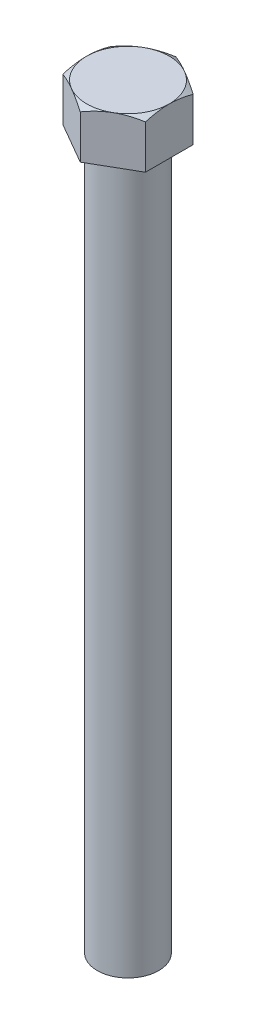
ISO-10303-21;
HEADER;
FILE_DESCRIPTION(('STEP AP214'),'2;1');
FILE_NAME('part.step','',(''),(''),'','','');
FILE_SCHEMA(('AUTOMOTIVE_DESIGN { 1 0 10303 214 1 1 1 1 }'));
ENDSEC;
DATA;
#1=APPLICATION_CONTEXT('core data for automotive mechanical design processes');
#2=APPLICATION_PROTOCOL_DEFINITION('international standard','automotive_design',2000,#1);
#3=PRODUCT_CONTEXT('',#1,'mechanical');
#4=PRODUCT('Part','Part','',(#3));
#5=PRODUCT_RELATED_PRODUCT_CATEGORY('part','',(#4));
#6=PRODUCT_DEFINITION_FORMATION('','',#4);
#7=PRODUCT_DEFINITION_CONTEXT('part definition',#1,'design');
#8=PRODUCT_DEFINITION('design','',#6,#7);
#9=PRODUCT_DEFINITION_SHAPE('','',#8);
#10=(LENGTH_UNIT() NAMED_UNIT(*) SI_UNIT(.MILLI.,.METRE.));
#11=(NAMED_UNIT(*) PLANE_ANGLE_UNIT() SI_UNIT($,.RADIAN.));
#12=(NAMED_UNIT(*) SI_UNIT($,.STERADIAN.) SOLID_ANGLE_UNIT());
#13=UNCERTAINTY_MEASURE_WITH_UNIT(LENGTH_MEASURE(1.E-05),#10,'distance_accuracy_value','');
#14=(GEOMETRIC_REPRESENTATION_CONTEXT(3) GLOBAL_UNCERTAINTY_ASSIGNED_CONTEXT((#13)) GLOBAL_UNIT_ASSIGNED_CONTEXT((#10,
#11,#12)) REPRESENTATION_CONTEXT('',''));
#15=CARTESIAN_POINT('',(0.,0.,0.));
#16=DIRECTION('',(0.,0.,1.));
#17=DIRECTION('',(1.,0.,0.));
#18=AXIS2_PLACEMENT_3D('',#15,#16,#17);
#19=CARTESIAN_POINT('',(4.44499999999997,2.54,-2.56632194654794));
#20=DIRECTION('',(-0.499999999999995,0.,0.866025403784442));
#21=DIRECTION('',(0.866025403784442,0.,0.499999999999995));
#22=AXIS2_PLACEMENT_3D('',#19,#20,#21);
#23=PLANE('',#22);
#24=CARTESIAN_POINT('',(4.44519999999997,2.14292194429822,-2.5662064764941));
#25=CARTESIAN_POINT('',(4.24986579470797,2.20805657093736,-2.67898273250138));
#26=CARTESIAN_POINT('',(4.05284547477849,2.2672939412632,-2.79273246724849));
#27=CARTESIAN_POINT('',(3.65539328473748,2.37069291144292,-3.02220159615867));
#28=CARTESIAN_POINT('',(3.45495435293051,2.41481793333261,-3.1379250673935));
#29=CARTESIAN_POINT('',(3.05656052986786,2.48350433724155,-3.36793784838221));
#30=CARTESIAN_POINT('',(2.85866693318103,2.50852287412248,-3.48219176970025));
#31=CARTESIAN_POINT('',(2.46194867413884,2.53838874032065,-3.71123716335069));
#32=CARTESIAN_POINT('',(2.26312545356158,2.54326080228227,-3.82602780327212));
#33=CARTESIAN_POINT('',(1.89161923394912,2.53312038077342,-4.04051701917099));
#34=CARTESIAN_POINT('',(1.71888059668701,2.52059771326113,-4.14024771789372));
#35=CARTESIAN_POINT('',(1.37452870288893,2.48090971292823,-4.339059376474));
#36=CARTESIAN_POINT('',(1.20291663722813,2.45373082512862,-4.43813964877945));
#37=CARTESIAN_POINT('',(0.857854865734964,2.38578630030974,-4.63736115543807));
#38=CARTESIAN_POINT('',(0.684448828706878,2.34473267413266,-4.73747717759534));
#39=CARTESIAN_POINT('',(0.340222933799418,2.25155731393392,-4.9362160906822));
#40=CARTESIAN_POINT('',(0.169398666530116,2.19945747021142,-5.03484152737425));
#41=CARTESIAN_POINT('',(-0.000200000000000184,2.14292194429822,-5.13275936314961));
#42=B_SPLINE_CURVE_WITH_KNOTS('',3,(#24,#25,#26,#27,#28,#29,#30,#31,#32,#33,#34,#35,#36,#37,#38,
#39,#40,#41),.UNSPECIFIED.,.F.,.F.,(4,2,2,2,2,2,2,2,4),(0.,0.704583898211653,1.41086131642101,
2.09965901433262,2.78761086425163,3.38660323540636,3.98615054427457,4.59899609230844,
5.21063832934908),.UNSPECIFIED.);
#43=CARTESIAN_POINT('',(4.44499999999997,2.14298861321456,-2.56632194654794));
#44=VERTEX_POINT('',#43);
#45=CARTESIAN_POINT('',(2.22249999999998,2.54,-3.84948291982184));
#46=VERTEX_POINT('',#45);
#47=EDGE_CURVE('E119',#44,#46,#42,.T.);
#48=ORIENTED_EDGE('',*,*,#47,.F.);
#49=DIRECTION('',(0.,-1.,0.));
#50=VECTOR('',#49,1.);
#51=CARTESIAN_POINT('',(4.44499999999997,2.54,-2.56632194654794));
#52=LINE('',#51,#50);
#53=CARTESIAN_POINT('',(4.44499999999997,-2.54,-2.56632194654794));
#54=VERTEX_POINT('',#53);
#55=EDGE_CURVE('E310',#44,#54,#52,.T.);
#56=ORIENTED_EDGE('',*,*,#55,.T.);
#57=DIRECTION('',(-0.866025403784441,0.,-0.499999999999995));
#58=VECTOR('',#57,1.);
#59=CARTESIAN_POINT('',(4.44499999999997,-2.54,-2.56632194654794));
#60=LINE('',#59,#58);
#61=CARTESIAN_POINT('',(0.,-2.54,-5.13264389309577));
#62=VERTEX_POINT('',#61);
#63=EDGE_CURVE('E128',#54,#62,#60,.T.);
#64=ORIENTED_EDGE('',*,*,#63,.T.);
#65=DIRECTION('',(0.,-1.,0.));
#66=VECTOR('',#65,1.);
#67=CARTESIAN_POINT('',(0.,2.54,-5.13264389309577));
#68=LINE('',#67,#66);
#69=CARTESIAN_POINT('',(0.,2.14298861321456,-5.13264389309577));
#70=VERTEX_POINT('',#69);
#71=EDGE_CURVE('E146',#70,#62,#68,.T.);
#72=ORIENTED_EDGE('',*,*,#71,.F.);
#73=EDGE_CURVE('E129',#46,#70,#42,.T.);
#74=ORIENTED_EDGE('',*,*,#73,.F.);
#75=EDGE_LOOP('',(#48,#56,#64,#72,#74));
#76=FACE_BOUND('',#75,.T.);
#77=ADVANCED_FACE('F46',(#76),#23,.F.);
#78=CARTESIAN_POINT('',(0.,2.54,-5.13264389309577));
#79=DIRECTION('',(0.500000000000001,0.,0.866025403784438));
#80=DIRECTION('',(0.866025403784438,0.,-0.500000000000001));
#81=AXIS2_PLACEMENT_3D('',#78,#79,#80);
#82=PLANE('',#81);
#83=CARTESIAN_POINT('',(0.000200000000000009,2.14292194429822,-5.13275936314961));
#84=CARTESIAN_POINT('',(-0.195134205292001,2.20805657093736,-5.01998310714233));
#85=CARTESIAN_POINT('',(-0.392154525221478,2.2672939412632,-4.90623337239522));
#86=CARTESIAN_POINT('',(-0.789606715262486,2.37069291144293,-4.67676424348504));
#87=CARTESIAN_POINT('',(-0.990045647069459,2.41481793333262,-4.5610407722502));
#88=CARTESIAN_POINT('',(-1.38843947013211,2.48350433724155,-4.3310279912615));
#89=CARTESIAN_POINT('',(-1.58633306681894,2.50852287412248,-4.21677406994346));
#90=CARTESIAN_POINT('',(-1.98305132586113,2.53838874032066,-3.98772867629301));
#91=CARTESIAN_POINT('',(-2.18187454643838,2.54326080228228,-3.87293803637158));
#92=CARTESIAN_POINT('',(-2.55338076605084,2.53312038077344,-3.6584488204727));
#93=CARTESIAN_POINT('',(-2.72611940331296,2.52059771326114,-3.55871812174997));
#94=CARTESIAN_POINT('',(-3.07047129711105,2.48090971292824,-3.35990646316969));
#95=CARTESIAN_POINT('',(-3.24208336277185,2.45373082512863,-3.26082619086423));
#96=CARTESIAN_POINT('',(-3.58714513426502,2.38578630030975,-3.0616046842056));
#97=CARTESIAN_POINT('',(-3.76055117129311,2.34473267413267,-2.96148866204833));
#98=CARTESIAN_POINT('',(-4.10477706620058,2.25155731393393,-2.76274974896146));
#99=CARTESIAN_POINT('',(-4.27560133346989,2.19945747021143,-2.66412431226941));
#100=CARTESIAN_POINT('',(-4.44520000000001,2.14292194429822,-2.56620647649404));
#101=B_SPLINE_CURVE_WITH_KNOTS('',3,(#83,#84,#85,#86,#87,#88,#89,#90,#91,#92,#93,#94,#95,#96,
#97,#98,#99,#100),.UNSPECIFIED.,.F.,.F.,(4,2,2,2,2,2,2,2,4),(0.,0.704583898211653,
1.41086131642101,2.09965901433262,2.78761086425163,3.38660323540637,3.9861505442746,
4.59899609230849,5.21063832934914),.UNSPECIFIED.);
#102=CARTESIAN_POINT('',(-2.22250000000001,2.54,-3.84948291982183));
#103=VERTEX_POINT('',#102);
#104=EDGE_CURVE('E136',#70,#103,#101,.T.);
#105=ORIENTED_EDGE('',*,*,#104,.F.);
#106=ORIENTED_EDGE('',*,*,#71,.T.);
#107=DIRECTION('',(-0.866025403784438,0.,0.500000000000001));
#108=VECTOR('',#107,1.);
#109=CARTESIAN_POINT('',(0.,-2.54,-5.13264389309577));
#110=LINE('',#109,#108);
#111=CARTESIAN_POINT('',(-4.44500000000001,-2.54,-2.56632194654788));
#112=VERTEX_POINT('',#111);
#113=EDGE_CURVE('E296',#62,#112,#110,.T.);
#114=ORIENTED_EDGE('',*,*,#113,.T.);
#115=DIRECTION('',(0.,-1.,0.));
#116=VECTOR('',#115,1.);
#117=CARTESIAN_POINT('',(-4.44500000000001,2.54,-2.56632194654788));
#118=LINE('',#117,#116);
#119=CARTESIAN_POINT('',(-4.44500000000001,2.14298861321456,-2.56632194654788));
#120=VERTEX_POINT('',#119);
#121=EDGE_CURVE('E222',#120,#112,#118,.T.);
#122=ORIENTED_EDGE('',*,*,#121,.F.);
#123=EDGE_CURVE('E149',#103,#120,#101,.T.);
#124=ORIENTED_EDGE('',*,*,#123,.F.);
#125=EDGE_LOOP('',(#105,#106,#114,#122,#124));
#126=FACE_BOUND('',#125,.T.);
#127=ADVANCED_FACE('F210',(#126),#82,.F.);
#128=CARTESIAN_POINT('',(-4.44500000000001,2.54,-2.56632194654788));
#129=DIRECTION('',(1.,0.,0.));
#130=DIRECTION('',(0.,0.,-1.));
#131=AXIS2_PLACEMENT_3D('',#128,#129,#130);
#132=PLANE('',#131);
#133=CARTESIAN_POINT('',(-4.44500000000003,-0.913793553764363,-9.43225036305228));
#134=CARTESIAN_POINT('',(-4.44500000000003,-0.799939464876854,-9.21422222232646));
#135=CARTESIAN_POINT('',(-4.44500000000003,-0.68662714073554,-8.99590893694939));
#136=CARTESIAN_POINT('',(-4.44500000000003,-0.461361050932909,-8.55857151988882));
#137=CARTESIAN_POINT('',(-4.44500000000003,-0.349407341607159,-8.33954735920261));
#138=CARTESIAN_POINT('',(-4.44500000000003,-0.126979863125515,-7.90034356959816));
#139=CARTESIAN_POINT('',(-4.44500000000003,-0.0165085071575113,-7.68016271663262));
#140=CARTESIAN_POINT('',(-4.44500000000002,0.202398705212408,-7.23879398225191));
#141=CARTESIAN_POINT('',(-4.44500000000002,0.310834590773045,-7.01760611531901));
#142=CARTESIAN_POINT('',(-4.44500000000002,0.531229787322069,-6.56146713388191));
#143=CARTESIAN_POINT('',(-4.44500000000002,0.643041856033314,-6.3264446904743));
#144=CARTESIAN_POINT('',(-4.44500000000002,0.863040494433213,-5.85471049641595));
#145=CARTESIAN_POINT('',(-4.44500000000002,0.97122714911754,-5.61799878552712));
#146=CARTESIAN_POINT('',(-4.44500000000002,1.18283489632335,-5.14258317678223));
#147=CARTESIAN_POINT('',(-4.44500000000002,1.28625830016107,-4.90388031296643));
#148=CARTESIAN_POINT('',(-4.44500000000001,1.48686883477102,-4.42388087539124));
#149=CARTESIAN_POINT('',(-4.44500000000001,1.58405654672986,-4.18258454580583));
#150=CARTESIAN_POINT('',(-4.44500000000001,1.78084193214057,-3.66873426469664));
#151=CARTESIAN_POINT('',(-4.44500000000001,1.87942394276431,-3.39578596515782));
#152=CARTESIAN_POINT('',(-4.44500000000001,2.0621435600319,-2.84497498911748));
#153=CARTESIAN_POINT('',(-4.44500000000001,2.1462788796667,-2.56711154218041));
#154=CARTESIAN_POINT('',(-4.44500000000001,2.29293585486918,-2.01168629382167));
#155=CARTESIAN_POINT('',(-4.44500000000001,2.35586873274095,-1.73423723011389));
#156=CARTESIAN_POINT('',(-4.445,2.43120349492403,-1.31469921034624));
#157=CARTESIAN_POINT('',(-4.445,2.45313637580591,-1.17430713518009));
#158=CARTESIAN_POINT('',(-4.445,2.48996434819672,-0.892612224475832));
#159=CARTESIAN_POINT('',(-4.445,2.50486063425895,-0.751309547655664));
#160=CARTESIAN_POINT('',(-4.445,2.52727959876194,-0.465555537822996));
#161=CARTESIAN_POINT('',(-4.445,2.53466480236686,-0.321093292334079));
#162=CARTESIAN_POINT('',(-4.445,2.54128879275954,-0.0319812773757936));
#163=CARTESIAN_POINT('',(-4.445,2.54052763417278,0.112668490829636));
#164=CARTESIAN_POINT('',(-4.445,2.53088783566023,0.401713765202374));
#165=CARTESIAN_POINT('',(-4.445,2.52200822574438,0.546109238921088));
#166=CARTESIAN_POINT('',(-4.445,2.49649313483878,0.83419867818099));
#167=CARTESIAN_POINT('',(-4.445,2.47985743787404,0.977892624074928));
#168=CARTESIAN_POINT('',(-4.44499999999999,2.41832310581975,1.41360737399664));
#169=CARTESIAN_POINT('',(-4.44499999999999,2.36204122384692,1.70406586069358));
#170=CARTESIAN_POINT('',(-4.44499999999999,2.2602209118653,2.13546189272905));
#171=CARTESIAN_POINT('',(-4.44499999999999,2.22336551212094,2.27859390746492));
#172=CARTESIAN_POINT('',(-4.44499999999999,2.14468169228814,2.56349565803156));
#173=CARTESIAN_POINT('',(-4.44499999999999,2.1028532671832,2.70526539248799));
#174=CARTESIAN_POINT('',(-4.44499999999999,1.96636328615321,3.14371334498782));
#175=CARTESIAN_POINT('',(-4.44499999999999,1.86447604841242,3.43813571248947));
#176=CARTESIAN_POINT('',(-4.44499999999999,1.64771207452743,4.02217410357603));
#177=CARTESIAN_POINT('',(-4.44499999999998,1.53283050448568,4.31178829226819));
#178=CARTESIAN_POINT('',(-4.44499999999998,1.29375704778267,4.88763477422153));
#179=CARTESIAN_POINT('',(-4.44499999999998,1.16955132017274,5.17386127941996));
#180=CARTESIAN_POINT('',(-4.44499999999998,0.914606930430403,5.74331493687461));
#181=CARTESIAN_POINT('',(-4.44499999999998,0.783869290414999,6.02654255004504));
#182=CARTESIAN_POINT('',(-4.44499999999998,0.526196668351574,6.57249307029261));
#183=CARTESIAN_POINT('',(-4.44499999999998,0.399561917038162,6.83535826659632));
#184=CARTESIAN_POINT('',(-4.44499999999997,0.14307880432994,7.35952757385614));
#185=CARTESIAN_POINT('',(-4.44499999999997,0.0132302933758086,7.62083161145517));
#186=CARTESIAN_POINT('',(-4.44499999999997,-0.248386588974362,8.14106821825079));
#187=CARTESIAN_POINT('',(-4.44499999999997,-0.380144316428686,8.40000615273979));
#188=CARTESIAN_POINT('',(-4.44499999999997,-0.645618837036988,8.91684341347261));
#189=CARTESIAN_POINT('',(-4.44499999999997,-0.779335430293971,9.17474284231579));
#190=CARTESIAN_POINT('',(-4.44499999999997,-0.913793553764365,9.43225036305231));
#191=B_SPLINE_CURVE_WITH_KNOTS('',3,(#133,#134,#135,#136,#137,#138,#139,#140,#141,#142,#143,
#144,#145,#146,#147,#148,#149,#150,#151,#152,#153,#154,#155,#156,#157,#158,#159,#160,#161,#162,
#163,#164,#165,#166,#167,#168,#169,#170,#171,#172,#173,#174,#175,#176,#177,#178,#179,#180,#181,
#182,#183,#184,#185,#186,#187,#188,#189,#190),.UNSPECIFIED.,.F.,.F.,(4,2,2,2,2,2,2,2,2,2,2,2,2,
2,2,2,2,2,2,2,2,2,2,2,2,2,2,2,4),(0.,0.737898670351122,1.47582783416407,2.21484002208093,
2.95384161533626,3.73461045483919,4.51536097685688,5.29572856811453,6.07602332062079,
6.94634491301855,7.81680415644895,8.66925110589245,9.09538659456246,9.52144971518079,
9.95517785135082,10.3889030791563,10.8226801350915,11.2564692706476,12.1425569444736,
12.5859066800292,13.0292568628128,13.9634179036872,14.8979276029344,15.8338530320361,
16.7696324629604,17.6449395741668,18.5202874965781,19.3918749857373,20.263374142887),.UNSPECIFIED.);
#192=CARTESIAN_POINT('',(-4.445,2.54,0.));
#193=VERTEX_POINT('',#192);
#194=EDGE_CURVE('E204',#120,#193,#191,.T.);
#195=ORIENTED_EDGE('',*,*,#194,.F.);
#196=ORIENTED_EDGE('',*,*,#121,.T.);
#197=DIRECTION('',(0.,0.,1.));
#198=VECTOR('',#197,1.);
#199=CARTESIAN_POINT('',(-4.44500000000001,-2.54,-2.56632194654788));
#200=LINE('',#199,#198);
#201=CARTESIAN_POINT('',(-4.44499999999999,-2.54,2.56632194654791));
#202=VERTEX_POINT('',#201);
#203=EDGE_CURVE('E243',#112,#202,#200,.T.);
#204=ORIENTED_EDGE('',*,*,#203,.T.);
#205=DIRECTION('',(0.,-1.,0.));
#206=VECTOR('',#205,1.);
#207=CARTESIAN_POINT('',(-4.44499999999999,2.54,2.56632194654791));
#208=LINE('',#207,#206);
#209=CARTESIAN_POINT('',(-4.44499999999999,2.14298861321456,2.56632194654791));
#210=VERTEX_POINT('',#209);
#211=EDGE_CURVE('E241',#210,#202,#208,.T.);
#212=ORIENTED_EDGE('',*,*,#211,.F.);
#213=EDGE_CURVE('E197',#193,#210,#191,.T.);
#214=ORIENTED_EDGE('',*,*,#213,.F.);
#215=EDGE_LOOP('',(#195,#196,#204,#212,#214));
#216=FACE_BOUND('',#215,.T.);
#217=ADVANCED_FACE('F206',(#216),#132,.F.);
#218=CARTESIAN_POINT('',(-4.44499999999999,2.54,2.56632194654791));
#219=DIRECTION('',(0.499999999999995,0.,-0.866025403784441));
#220=DIRECTION('',(-0.866025403784442,0.,-0.499999999999995));
#221=AXIS2_PLACEMENT_3D('',#218,#219,#220);
#222=PLANE('',#221);
#223=CARTESIAN_POINT('',(-4.44519999999999,2.14292194429822,2.56620647649407));
#224=CARTESIAN_POINT('',(-4.24986579470799,2.20805657093736,2.67898273250135));
#225=CARTESIAN_POINT('',(-4.05284547477851,2.2672939412632,2.79273246724846));
#226=CARTESIAN_POINT('',(-3.6553932847375,2.37069291144293,3.02220159615864));
#227=CARTESIAN_POINT('',(-3.45495435293053,2.41481793333262,3.13792506739347));
#228=CARTESIAN_POINT('',(-3.05656052986788,2.48350433724155,3.36793784838217));
#229=CARTESIAN_POINT('',(-2.85866693318105,2.50852287412248,3.48219176970022));
#230=CARTESIAN_POINT('',(-2.46194867413886,2.53838874032066,3.71123716335066));
#231=CARTESIAN_POINT('',(-2.2631254535616,2.54326080228228,3.82602780327209));
#232=CARTESIAN_POINT('',(-1.89161923394914,2.53312038077344,4.04051701917096));
#233=CARTESIAN_POINT('',(-1.71888059668702,2.52059771326115,4.14024771789369));
#234=CARTESIAN_POINT('',(-1.37452870288893,2.48090971292824,4.33905937647398));
#235=CARTESIAN_POINT('',(-1.20291663722812,2.45373082512863,4.43813964877943));
#236=CARTESIAN_POINT('',(-0.857854865734951,2.38578630030975,4.63736115543806));
#237=CARTESIAN_POINT('',(-0.684448828706861,2.34473267413267,4.73747717759533));
#238=CARTESIAN_POINT('',(-0.340222933799393,2.25155731393393,4.93621609068219));
#239=CARTESIAN_POINT('',(-0.169398666530086,2.19945747021143,5.03484152737425));
#240=CARTESIAN_POINT('',(0.000200000000035309,2.14292194429822,5.13275936314961));
#241=B_SPLINE_CURVE_WITH_KNOTS('',3,(#223,#224,#225,#226,#227,#228,#229,#230,#231,#232,#233,
#234,#235,#236,#237,#238,#239,#240),.UNSPECIFIED.,.F.,.F.,(4,2,2,2,2,2,2,2,4),(0.,
0.704583898211653,1.41086131642101,2.09965901433262,2.78761086425163,3.38660323540637,
3.9861505442746,4.59899609230849,5.21063832934914),.UNSPECIFIED.);
#242=CARTESIAN_POINT('',(-2.22249999999998,2.54,3.84948291982184));
#243=VERTEX_POINT('',#242);
#244=EDGE_CURVE('E205',#210,#243,#241,.T.);
#245=ORIENTED_EDGE('',*,*,#244,.F.);
#246=ORIENTED_EDGE('',*,*,#211,.T.);
#247=DIRECTION('',(0.866025403784442,0.,0.499999999999995));
#248=VECTOR('',#247,1.);
#249=CARTESIAN_POINT('',(-4.44499999999999,-2.54,2.56632194654791));
#250=LINE('',#249,#248);
#251=CARTESIAN_POINT('',(0.,-2.54,5.13264389309577));
#252=VERTEX_POINT('',#251);
#253=EDGE_CURVE('E300',#202,#252,#250,.T.);
#254=ORIENTED_EDGE('',*,*,#253,.T.);
#255=DIRECTION('',(0.,-1.,0.));
#256=VECTOR('',#255,1.);
#257=CARTESIAN_POINT('',(0.,2.54,5.13264389309577));
#258=LINE('',#257,#256);
#259=CARTESIAN_POINT('',(0.,2.14298861321456,5.13264389309577));
#260=VERTEX_POINT('',#259);
#261=EDGE_CURVE('E248',#260,#252,#258,.T.);
#262=ORIENTED_EDGE('',*,*,#261,.F.);
#263=EDGE_CURVE('E191',#243,#260,#241,.T.);
#264=ORIENTED_EDGE('',*,*,#263,.F.);
#265=EDGE_LOOP('',(#245,#246,#254,#262,#264));
#266=FACE_BOUND('',#265,.T.);
#267=ADVANCED_FACE('F209',(#266),#222,.F.);
#268=CARTESIAN_POINT('',(0.,2.54,5.13264389309577));
#269=DIRECTION('',(-0.500000000000007,0.,-0.866025403784435));
#270=DIRECTION('',(-0.866025403784435,0.,0.500000000000007));
#271=AXIS2_PLACEMENT_3D('',#268,#269,#270);
#272=PLANE('',#271);
#273=CARTESIAN_POINT('',(-0.000199999999964167,2.14292194429822,5.13275936314961));
#274=CARTESIAN_POINT('',(0.195134205292037,2.20805657093736,5.01998310714233));
#275=CARTESIAN_POINT('',(0.392154525221512,2.2672939412632,4.90623337239522));
#276=CARTESIAN_POINT('',(0.789606715262519,2.37069291144292,4.67676424348504));
#277=CARTESIAN_POINT('',(0.990045647069491,2.41481793333262,4.5610407722502));
#278=CARTESIAN_POINT('',(1.38843947013214,2.48350433724155,4.33102799126149));
#279=CARTESIAN_POINT('',(1.58633306681897,2.50852287412248,4.21677406994345));
#280=CARTESIAN_POINT('',(1.98305132586115,2.53838874032066,3.98772867629299));
#281=CARTESIAN_POINT('',(2.18187454643841,2.54326080228228,3.87293803637157));
#282=CARTESIAN_POINT('',(2.55338076605087,2.53312038077344,3.65844882047269));
#283=CARTESIAN_POINT('',(2.72611940331298,2.52059771326114,3.55871812174996));
#284=CARTESIAN_POINT('',(3.07047129711107,2.48090971292824,3.35990646316967));
#285=CARTESIAN_POINT('',(3.24208336277188,2.45373082512863,3.26082619086421));
#286=CARTESIAN_POINT('',(3.58714513426505,2.38578630030975,3.06160468420558));
#287=CARTESIAN_POINT('',(3.76055117129313,2.34473267413267,2.9614886620483));
#288=CARTESIAN_POINT('',(4.1047770662006,2.25155731393393,2.76274974896143));
#289=CARTESIAN_POINT('',(4.2756013334699,2.19945747021143,2.66412431226938));
#290=CARTESIAN_POINT('',(4.44520000000002,2.14292194429822,2.56620647649401));
#291=B_SPLINE_CURVE_WITH_KNOTS('',3,(#273,#274,#275,#276,#277,#278,#279,#280,#281,#282,#283,
#284,#285,#286,#287,#288,#289,#290),.UNSPECIFIED.,.F.,.F.,(4,2,2,2,2,2,2,2,4),(0.,
0.704583898211652,1.41086131642101,2.09965901433262,2.78761086425163,3.38660323540637,
3.9861505442746,4.59899609230849,5.21063832934914),.UNSPECIFIED.);
#292=CARTESIAN_POINT('',(2.22250000000003,2.54,3.84948291982181));
#293=VERTEX_POINT('',#292);
#294=EDGE_CURVE('E264',#260,#293,#291,.T.);
#295=ORIENTED_EDGE('',*,*,#294,.F.);
#296=ORIENTED_EDGE('',*,*,#261,.T.);
#297=DIRECTION('',(0.866025403784435,0.,-0.500000000000007));
#298=VECTOR('',#297,1.);
#299=CARTESIAN_POINT('',(0.,-2.54,5.13264389309577));
#300=LINE('',#299,#298);
#301=CARTESIAN_POINT('',(4.44500000000003,-2.54,2.56632194654785));
#302=VERTEX_POINT('',#301);
#303=EDGE_CURVE('E305',#252,#302,#300,.T.);
#304=ORIENTED_EDGE('',*,*,#303,.T.);
#305=DIRECTION('',(0.,-1.,0.));
#306=VECTOR('',#305,1.);
#307=CARTESIAN_POINT('',(4.44500000000003,2.54,2.56632194654785));
#308=LINE('',#307,#306);
#309=CARTESIAN_POINT('',(4.44500000000003,2.14298861321456,2.56632194654785));
#310=VERTEX_POINT('',#309);
#311=EDGE_CURVE('E253',#310,#302,#308,.T.);
#312=ORIENTED_EDGE('',*,*,#311,.F.);
#313=EDGE_CURVE('E184',#293,#310,#291,.T.);
#314=ORIENTED_EDGE('',*,*,#313,.F.);
#315=EDGE_LOOP('',(#295,#296,#304,#312,#314));
#316=FACE_BOUND('',#315,.T.);
#317=ADVANCED_FACE('F263',(#316),#272,.F.);
#318=CARTESIAN_POINT('',(4.44500000000003,2.54,2.56632194654785));
#319=DIRECTION('',(-1.,0.,0.));
#320=DIRECTION('',(0.,0.,1.));
#321=AXIS2_PLACEMENT_3D('',#318,#319,#320);
#322=PLANE('',#321);
#323=CARTESIAN_POINT('',(4.4450000000001,-0.913793553764364,9.43225036305225));
#324=CARTESIAN_POINT('',(4.44500000000009,-0.799939464876855,9.21422222232643));
#325=CARTESIAN_POINT('',(4.44500000000009,-0.68662714073554,8.99590893694936));
#326=CARTESIAN_POINT('',(4.44500000000009,-0.46136105093291,8.55857151988879));
#327=CARTESIAN_POINT('',(4.44500000000009,-0.349407341607161,8.33954735920258));
#328=CARTESIAN_POINT('',(4.44500000000008,-0.126979863125517,7.90034356959814));
#329=CARTESIAN_POINT('',(4.44500000000008,-0.0165085071575137,7.68016271663259));
#330=CARTESIAN_POINT('',(4.44500000000007,0.202398705212406,7.23879398225188));
#331=CARTESIAN_POINT('',(4.44500000000007,0.310834590773043,7.01760611531898));
#332=CARTESIAN_POINT('',(4.44500000000007,0.531229787322067,6.56146713388189));
#333=CARTESIAN_POINT('',(4.44500000000007,0.643041856033312,6.32644469047428));
#334=CARTESIAN_POINT('',(4.44500000000006,0.863040494433211,5.85471049641593));
#335=CARTESIAN_POINT('',(4.44500000000006,0.971227149117539,5.61799878552709));
#336=CARTESIAN_POINT('',(4.44500000000005,1.18283489632335,5.1425831767822));
#337=CARTESIAN_POINT('',(4.44500000000005,1.28625830016107,4.9038803129664));
#338=CARTESIAN_POINT('',(4.44500000000004,1.48686883477102,4.42388087539121));
#339=CARTESIAN_POINT('',(4.44500000000004,1.58405654672986,4.18258454580581));
#340=CARTESIAN_POINT('',(4.44500000000004,1.78084193214056,3.66873426469662));
#341=CARTESIAN_POINT('',(4.44500000000003,1.87942394276431,3.39578596515779));
#342=CARTESIAN_POINT('',(4.44500000000003,2.0621435600319,2.84497498911745));
#343=CARTESIAN_POINT('',(4.44500000000003,2.1462788796667,2.56711154218038));
#344=CARTESIAN_POINT('',(4.44500000000002,2.29293585486918,2.01168629382164));
#345=CARTESIAN_POINT('',(4.44500000000002,2.35586873274095,1.73423723011386));
#346=CARTESIAN_POINT('',(4.44500000000001,2.43120349492403,1.31469921034621));
#347=CARTESIAN_POINT('',(4.44500000000001,2.45313637580591,1.17430713518007));
#348=CARTESIAN_POINT('',(4.44500000000001,2.48996434819672,0.892612224475803));
#349=CARTESIAN_POINT('',(4.44500000000001,2.50486063425895,0.751309547655635));
#350=CARTESIAN_POINT('',(4.445,2.52727959876194,0.465555537822968));
#351=CARTESIAN_POINT('',(4.445,2.53466480236686,0.321093292334051));
#352=CARTESIAN_POINT('',(4.445,2.54128879275954,0.0319812773757654));
#353=CARTESIAN_POINT('',(4.445,2.54052763417279,-0.112668490829665));
#354=CARTESIAN_POINT('',(4.44499999999999,2.53088783566023,-0.401713765202402));
#355=CARTESIAN_POINT('',(4.44499999999999,2.52200822574438,-0.546109238921116));
#356=CARTESIAN_POINT('',(4.44499999999999,2.49649313483878,-0.834198678181018));
#357=CARTESIAN_POINT('',(4.44499999999999,2.47985743787404,-0.977892624074957));
#358=CARTESIAN_POINT('',(4.44499999999998,2.41832310581976,-1.41360737399667));
#359=CARTESIAN_POINT('',(4.44499999999998,2.36204122384692,-1.70406586069361));
#360=CARTESIAN_POINT('',(4.44499999999998,2.2602209118653,-2.13546189272908));
#361=CARTESIAN_POINT('',(4.44499999999998,2.22336551212094,-2.27859390746495));
#362=CARTESIAN_POINT('',(4.44499999999997,2.14468169228814,-2.56349565803159));
#363=CARTESIAN_POINT('',(4.44499999999997,2.10285326718321,-2.70526539248802));
#364=CARTESIAN_POINT('',(4.44499999999997,1.96636328615321,-3.14371334498785));
#365=CARTESIAN_POINT('',(4.44499999999996,1.86447604841243,-3.43813571248949));
#366=CARTESIAN_POINT('',(4.44499999999996,1.64771207452744,-4.02217410357606));
#367=CARTESIAN_POINT('',(4.44499999999995,1.53283050448568,-4.31178829226822));
#368=CARTESIAN_POINT('',(4.44499999999995,1.29375704778267,-4.88763477422156));
#369=CARTESIAN_POINT('',(4.44499999999994,1.16955132017274,-5.17386127941999));
#370=CARTESIAN_POINT('',(4.44499999999994,0.914606930430405,-5.74331493687464));
#371=CARTESIAN_POINT('',(4.44499999999994,0.783869290415,-6.02654255004507));
#372=CARTESIAN_POINT('',(4.44499999999993,0.526196668351575,-6.57249307029263));
#373=CARTESIAN_POINT('',(4.44499999999993,0.399561917038164,-6.83535826659635));
#374=CARTESIAN_POINT('',(4.44499999999992,0.143078804329941,-7.35952757385617));
#375=CARTESIAN_POINT('',(4.44499999999992,0.0132302933758094,-7.6208316114552));
#376=CARTESIAN_POINT('',(4.44499999999991,-0.248386588974361,-8.14106821825082));
#377=CARTESIAN_POINT('',(4.44499999999991,-0.380144316428685,-8.40000615273982));
#378=CARTESIAN_POINT('',(4.4449999999999,-0.645618837036987,-8.91684341347264));
#379=CARTESIAN_POINT('',(4.4449999999999,-0.77933543029397,-9.17474284231583));
#380=CARTESIAN_POINT('',(4.4449999999999,-0.913793553764365,-9.43225036305235));
#381=B_SPLINE_CURVE_WITH_KNOTS('',3,(#323,#324,#325,#326,#327,#328,#329,#330,#331,#332,#333,
#334,#335,#336,#337,#338,#339,#340,#341,#342,#343,#344,#345,#346,#347,#348,#349,#350,#351,#352,
#353,#354,#355,#356,#357,#358,#359,#360,#361,#362,#363,#364,#365,#366,#367,#368,#369,#370,#371,
#372,#373,#374,#375,#376,#377,#378,#379,#380),.UNSPECIFIED.,.F.,.F.,(4,2,2,2,2,2,2,2,2,2,2,2,2,
2,2,2,2,2,2,2,2,2,2,2,2,2,2,2,4),(0.,0.737898670351122,1.47582783416407,2.21484002208093,
2.95384161533625,3.73461045483918,4.51536097685688,5.29572856811453,6.07602332062079,
6.94634491301854,7.81680415644895,8.66925110589245,9.09538659456246,9.52144971518079,
9.95517785135082,10.3889030791563,10.8226801350915,11.2564692706476,12.1425569444736,
12.5859066800292,13.0292568628128,13.9634179036872,14.8979276029344,15.8338530320361,
16.7696324629604,17.6449395741668,18.5202874965781,19.3918749857373,20.263374142887),.UNSPECIFIED.);
#382=CARTESIAN_POINT('',(4.445,2.54,0.));
#383=VERTEX_POINT('',#382);
#384=EDGE_CURVE('E269',#310,#383,#381,.T.);
#385=ORIENTED_EDGE('',*,*,#384,.F.);
#386=ORIENTED_EDGE('',*,*,#311,.T.);
#387=DIRECTION('',(0.,0.,-1.));
#388=VECTOR('',#387,1.);
#389=CARTESIAN_POINT('',(4.44500000000003,-2.54,2.56632194654785));
#390=LINE('',#389,#388);
#391=EDGE_CURVE('E295',#302,#54,#390,.T.);
#392=ORIENTED_EDGE('',*,*,#391,.T.);
#393=ORIENTED_EDGE('',*,*,#55,.F.);
#394=EDGE_CURVE('E123',#383,#44,#381,.T.);
#395=ORIENTED_EDGE('',*,*,#394,.F.);
#396=EDGE_LOOP('',(#385,#386,#392,#393,#395));
#397=FACE_BOUND('',#396,.T.);
#398=ADVANCED_FACE('F290',(#397),#322,.F.);
#399=CARTESIAN_POINT('',(0.,-2.54,0.));
#400=DIRECTION('',(0.,1.,0.));
#401=DIRECTION('',(0.,0.,1.));
#402=AXIS2_PLACEMENT_3D('',#399,#400,#401);
#403=PLANE('',#402);
#404=CARTESIAN_POINT('',(0.,-2.54,0.));
#405=DIRECTION('',(0.,-1.,0.));
#406=DIRECTION('',(0.,0.,-1.));
#407=AXIS2_PLACEMENT_3D('',#404,#405,#406);
#408=CIRCLE('',#407,3.302);
#409=CARTESIAN_POINT('',(0.,-2.54,3.302));
#410=VERTEX_POINT('',#409);
#411=EDGE_CURVE('E12',#410,#410,#408,.T.);
#412=ORIENTED_EDGE('',*,*,#411,.F.);
#413=EDGE_LOOP('',(#412));
#414=FACE_BOUND('',#413,.T.);
#415=ORIENTED_EDGE('',*,*,#63,.F.);
#416=ORIENTED_EDGE('',*,*,#391,.F.);
#417=ORIENTED_EDGE('',*,*,#303,.F.);
#418=ORIENTED_EDGE('',*,*,#253,.F.);
#419=ORIENTED_EDGE('',*,*,#203,.F.);
#420=ORIENTED_EDGE('',*,*,#113,.F.);
#421=EDGE_LOOP('',(#415,#416,#417,#418,#419,#420));
#422=FACE_BOUND('',#421,.T.);
#423=ADVANCED_FACE('F286',(#414,#422),#403,.F.);
#424=CARTESIAN_POINT('',(0.,2.54,0.));
#425=DIRECTION('',(0.,-1.,0.));
#426=DIRECTION('',(0.,0.,1.));
#427=AXIS2_PLACEMENT_3D('',#424,#425,#426);
#428=CONICAL_SURFACE('',#427,4.445,1.0471975511966);
#429=ORIENTED_EDGE('',*,*,#263,.T.);
#430=ORIENTED_EDGE('',*,*,#294,.T.);
#431=CARTESIAN_POINT('',(0.,2.54,0.));
#432=DIRECTION('',(0.,1.,0.));
#433=DIRECTION('',(0.,0.,1.));
#434=AXIS2_PLACEMENT_3D('',#431,#432,#433);
#435=CIRCLE('',#434,4.445);
#436=EDGE_CURVE('E50',#243,#293,#435,.T.);
#437=ORIENTED_EDGE('',*,*,#436,.F.);
#438=EDGE_LOOP('',(#429,#430,#437));
#439=FACE_BOUND('',#438,.T.);
#440=ADVANCED_FACE('F289',(#439),#428,.T.);
#441=ORIENTED_EDGE('',*,*,#213,.T.);
#442=ORIENTED_EDGE('',*,*,#244,.T.);
#443=EDGE_CURVE('E232',#193,#243,#435,.T.);
#444=ORIENTED_EDGE('',*,*,#443,.F.);
#445=EDGE_LOOP('',(#441,#442,#444));
#446=FACE_BOUND('',#445,.T.);
#447=ADVANCED_FACE('F233',(#446),#428,.T.);
#448=ORIENTED_EDGE('',*,*,#123,.T.);
#449=ORIENTED_EDGE('',*,*,#194,.T.);
#450=EDGE_CURVE('E141',#103,#193,#435,.T.);
#451=ORIENTED_EDGE('',*,*,#450,.F.);
#452=EDGE_LOOP('',(#448,#449,#451));
#453=FACE_BOUND('',#452,.T.);
#454=ADVANCED_FACE('F228',(#453),#428,.T.);
#455=ORIENTED_EDGE('',*,*,#73,.T.);
#456=ORIENTED_EDGE('',*,*,#104,.T.);
#457=EDGE_CURVE('E133',#46,#103,#435,.T.);
#458=ORIENTED_EDGE('',*,*,#457,.F.);
#459=EDGE_LOOP('',(#455,#456,#458));
#460=FACE_BOUND('',#459,.T.);
#461=ADVANCED_FACE('F134',(#460),#428,.T.);
#462=ORIENTED_EDGE('',*,*,#47,.T.);
#463=EDGE_CURVE('E56',#383,#46,#435,.T.);
#464=ORIENTED_EDGE('',*,*,#463,.F.);
#465=ORIENTED_EDGE('',*,*,#394,.T.);
#466=EDGE_LOOP('',(#462,#464,#465));
#467=FACE_BOUND('',#466,.T.);
#468=ADVANCED_FACE('F121',(#467),#428,.T.);
#469=ORIENTED_EDGE('',*,*,#313,.T.);
#470=ORIENTED_EDGE('',*,*,#384,.T.);
#471=CARTESIAN_POINT('',(0.,2.54,0.));
#472=DIRECTION('',(0.,1.,0.));
#473=DIRECTION('',(0.,0.,1.));
#474=AXIS2_PLACEMENT_3D('',#471,#472,#473);
#475=CIRCLE('',#474,4.445);
#476=EDGE_CURVE('E64',#293,#383,#475,.T.);
#477=ORIENTED_EDGE('',*,*,#476,.F.);
#478=EDGE_LOOP('',(#469,#470,#477));
#479=FACE_BOUND('',#478,.T.);
#480=ADVANCED_FACE('F167',(#479),#428,.T.);
#481=CARTESIAN_POINT('',(0.,2.54,0.));
#482=DIRECTION('',(0.,1.,0.));
#483=DIRECTION('',(0.,0.,1.));
#484=AXIS2_PLACEMENT_3D('',#481,#482,#483);
#485=PLANE('',#484);
#486=ORIENTED_EDGE('',*,*,#436,.T.);
#487=ORIENTED_EDGE('',*,*,#476,.T.);
#488=ORIENTED_EDGE('',*,*,#463,.T.);
#489=ORIENTED_EDGE('',*,*,#457,.T.);
#490=ORIENTED_EDGE('',*,*,#450,.T.);
#491=ORIENTED_EDGE('',*,*,#443,.T.);
#492=EDGE_LOOP('',(#486,#487,#488,#489,#490,#491));
#493=FACE_BOUND('',#492,.T.);
#494=ADVANCED_FACE('F142',(#493),#485,.T.);
#495=CARTESIAN_POINT('',(0.,-78.74,0.));
#496=DIRECTION('',(0.,1.,0.));
#497=DIRECTION('',(0.,0.,1.));
#498=AXIS2_PLACEMENT_3D('',#495,#496,#497);
#499=CYLINDRICAL_SURFACE('',#498,3.302);
#500=CARTESIAN_POINT('',(0.,-78.74,0.));
#501=DIRECTION('',(0.,-1.,0.));
#502=DIRECTION('',(0.,0.,-1.));
#503=AXIS2_PLACEMENT_3D('',#500,#501,#502);
#504=CIRCLE('',#503,3.302);
#505=CARTESIAN_POINT('',(0.,-78.74,3.302));
#506=VERTEX_POINT('',#505);
#507=EDGE_CURVE('E274',#506,#506,#504,.T.);
#508=CARTESIAN_POINT('',(0.,-78.74,3.302));
#509=CARTESIAN_POINT('',(0.,-77.94625,3.302));
#510=CARTESIAN_POINT('',(0.,-77.1525,3.302));
#511=CARTESIAN_POINT('',(0.,-75.565,3.302));
#512=CARTESIAN_POINT('',(0.,-74.77125,3.302));
#513=CARTESIAN_POINT('',(0.,-73.18375,3.302));
#514=CARTESIAN_POINT('',(0.,-72.39,3.302));
#515=CARTESIAN_POINT('',(0.,-70.8025,3.302));
#516=CARTESIAN_POINT('',(0.,-70.00875,3.302));
#517=CARTESIAN_POINT('',(0.,-68.42125,3.302));
#518=CARTESIAN_POINT('',(0.,-67.6275,3.302));
#519=CARTESIAN_POINT('',(0.,-66.04,3.302));
#520=CARTESIAN_POINT('',(0.,-65.24625,3.302));
#521=CARTESIAN_POINT('',(0.,-63.65875,3.302));
#522=CARTESIAN_POINT('',(0.,-62.865,3.302));
#523=CARTESIAN_POINT('',(0.,-61.2775,3.302));
#524=CARTESIAN_POINT('',(0.,-60.48375,3.302));
#525=CARTESIAN_POINT('',(0.,-58.89625,3.302));
#526=CARTESIAN_POINT('',(0.,-58.1025,3.302));
#527=CARTESIAN_POINT('',(0.,-56.515,3.302));
#528=CARTESIAN_POINT('',(0.,-55.72125,3.302));
#529=CARTESIAN_POINT('',(0.,-54.13375,3.302));
#530=CARTESIAN_POINT('',(0.,-53.34,3.302));
#531=CARTESIAN_POINT('',(0.,-51.7525,3.302));
#532=CARTESIAN_POINT('',(0.,-50.95875,3.302));
#533=CARTESIAN_POINT('',(0.,-49.37125,3.302));
#534=CARTESIAN_POINT('',(0.,-48.5775,3.302));
#535=CARTESIAN_POINT('',(0.,-46.99,3.302));
#536=CARTESIAN_POINT('',(0.,-46.19625,3.302));
#537=CARTESIAN_POINT('',(0.,-44.60875,3.302));
#538=CARTESIAN_POINT('',(0.,-43.815,3.302));
#539=CARTESIAN_POINT('',(0.,-42.2275,3.302));
#540=CARTESIAN_POINT('',(0.,-41.43375,3.302));
#541=CARTESIAN_POINT('',(0.,-39.84625,3.302));
#542=CARTESIAN_POINT('',(0.,-39.0525,3.302));
#543=CARTESIAN_POINT('',(0.,-37.465,3.302));
#544=CARTESIAN_POINT('',(0.,-36.67125,3.302));
#545=CARTESIAN_POINT('',(0.,-35.08375,3.302));
#546=CARTESIAN_POINT('',(0.,-34.29,3.302));
#547=CARTESIAN_POINT('',(0.,-32.7025,3.302));
#548=CARTESIAN_POINT('',(0.,-31.90875,3.302));
#549=CARTESIAN_POINT('',(0.,-30.32125,3.302));
#550=CARTESIAN_POINT('',(0.,-29.5275,3.302));
#551=CARTESIAN_POINT('',(0.,-27.94,3.302));
#552=CARTESIAN_POINT('',(0.,-27.14625,3.302));
#553=CARTESIAN_POINT('',(0.,-25.55875,3.302));
#554=CARTESIAN_POINT('',(0.,-24.765,3.302));
#555=CARTESIAN_POINT('',(0.,-23.1775,3.302));
#556=CARTESIAN_POINT('',(0.,-22.38375,3.302));
#557=CARTESIAN_POINT('',(0.,-20.79625,3.302));
#558=CARTESIAN_POINT('',(0.,-20.0025,3.302));
#559=CARTESIAN_POINT('',(0.,-18.415,3.302));
#560=CARTESIAN_POINT('',(0.,-17.62125,3.302));
#561=CARTESIAN_POINT('',(0.,-16.03375,3.302));
#562=CARTESIAN_POINT('',(0.,-15.24,3.302));
#563=CARTESIAN_POINT('',(0.,-13.6525,3.302));
#564=CARTESIAN_POINT('',(0.,-12.85875,3.302));
#565=CARTESIAN_POINT('',(0.,-11.27125,3.302));
#566=CARTESIAN_POINT('',(0.,-10.4775,3.302));
#567=CARTESIAN_POINT('',(0.,-8.89,3.302));
#568=CARTESIAN_POINT('',(0.,-8.09625,3.302));
#569=CARTESIAN_POINT('',(0.,-6.50875,3.302));
#570=CARTESIAN_POINT('',(0.,-5.715,3.302));
#571=CARTESIAN_POINT('',(0.,-4.1275,3.302));
#572=CARTESIAN_POINT('',(0.,-3.33375,3.302));
#573=CARTESIAN_POINT('',(0.,-2.54,3.302));
#574=B_SPLINE_CURVE_WITH_KNOTS('',3,(#508,#509,#510,#511,#512,#513,#514,#515,#516,#517,#518,
#519,#520,#521,#522,#523,#524,#525,#526,#527,#528,#529,#530,#531,#532,#533,#534,#535,#536,#537,
#538,#539,#540,#541,#542,#543,#544,#545,#546,#547,#548,#549,#550,#551,#552,#553,#554,#555,#556,
#557,#558,#559,#560,#561,#562,#563,#564,#565,#566,#567,#568,#569,#570,#571,#572,#573),
.UNSPECIFIED.,.F.,.F.,(4,2,2,2,2,2,2,2,2,2,2,2,2,2,2,2,2,2,2,2,2,2,2,2,2,2,2,2,2,2,2,2,4),(0.,
2.38125,4.7625,7.14375,9.52500000000001,11.90625,14.2875,16.66875,19.05,21.43125,23.8125,
26.19375,28.575,30.95625,33.3375,35.71875,38.1,40.48125,42.8625,45.24375,47.625,50.00625,
52.3875,54.76875,57.15,59.53125,61.9125,64.29375,66.675,69.05625,71.4375,73.81875,76.2),.UNSPECIFIED.);
#575=EDGE_CURVE('BSEAM168',#506,#410,#574,.T.);
#576=ORIENTED_EDGE('',*,*,#507,.F.);
#577=ORIENTED_EDGE('',*,*,#411,.T.);
#578=ORIENTED_EDGE('',*,*,#575,.T.);
#579=ORIENTED_EDGE('',*,*,#575,.F.);
#580=EDGE_LOOP('',(#576,#578,#577,#579));
#581=FACE_BOUND('',#580,.T.);
#582=ADVANCED_FACE('F168',(#581),#499,.T.);
#583=CARTESIAN_POINT('',(0.,-78.74,0.));
#584=DIRECTION('',(0.,-1.,0.));
#585=DIRECTION('',(0.,0.,-1.));
#586=AXIS2_PLACEMENT_3D('',#583,#584,#585);
#587=PLANE('',#586);
#588=ORIENTED_EDGE('',*,*,#507,.T.);
#589=EDGE_LOOP('',(#588));
#590=FACE_BOUND('',#589,.T.);
#591=ADVANCED_FACE('F280',(#590),#587,.T.);
#592=CLOSED_SHELL('',(#77,#127,#217,#267,#317,#398,#423,#440,#447,#454,#461,#468,#480,#494,#582,#591));
#593=MANIFOLD_SOLID_BREP('B2',#592);
#594=ADVANCED_BREP_SHAPE_REPRESENTATION('',(#18,#593),#14);
#595=SHAPE_DEFINITION_REPRESENTATION(#9,#594);
ENDSEC;
END-ISO-10303-21;
